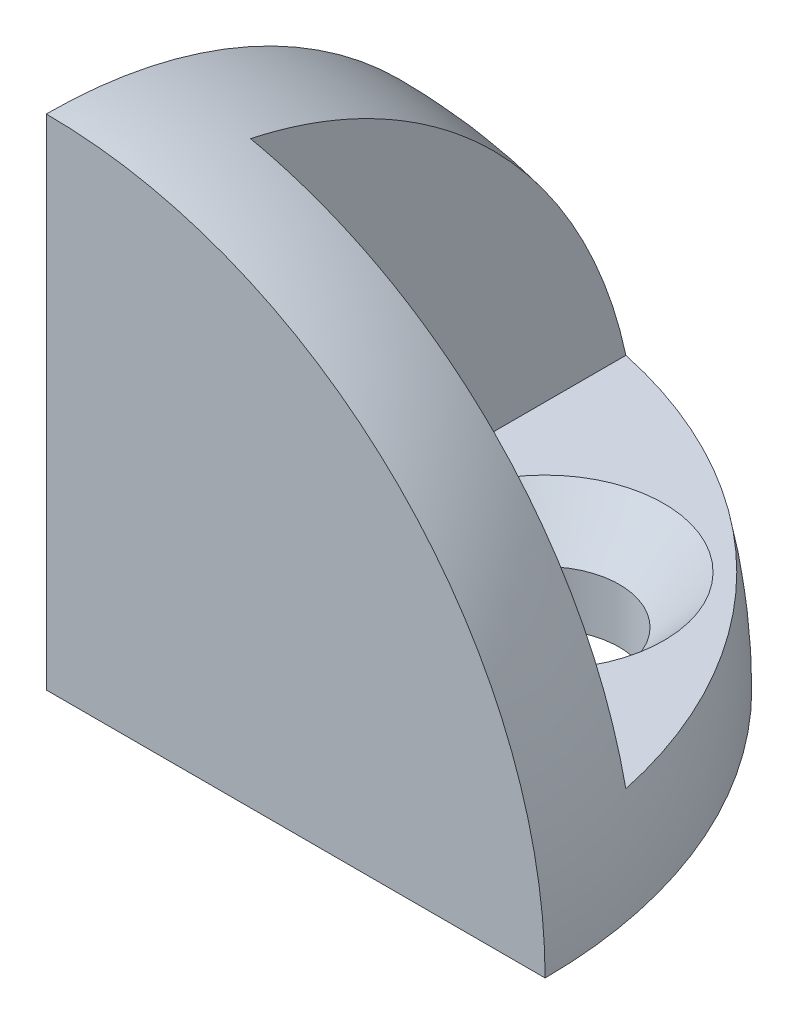
ISO-10303-21;
HEADER;
FILE_DESCRIPTION(('STEP AP214'),'2;1');
FILE_NAME('part.step','',(''),(''),'','','');
FILE_SCHEMA(('AUTOMOTIVE_DESIGN { 1 0 10303 214 1 1 1 1 }'));
ENDSEC;
DATA;
#1=APPLICATION_CONTEXT('core data for automotive mechanical design processes');
#2=APPLICATION_PROTOCOL_DEFINITION('international standard','automotive_design',2000,#1);
#3=PRODUCT_CONTEXT('',#1,'mechanical');
#4=PRODUCT('Part','Part','',(#3));
#5=PRODUCT_RELATED_PRODUCT_CATEGORY('part','',(#4));
#6=PRODUCT_DEFINITION_FORMATION('','',#4);
#7=PRODUCT_DEFINITION_CONTEXT('part definition',#1,'design');
#8=PRODUCT_DEFINITION('design','',#6,#7);
#9=PRODUCT_DEFINITION_SHAPE('','',#8);
#10=(LENGTH_UNIT() NAMED_UNIT(*) SI_UNIT(.MILLI.,.METRE.));
#11=(NAMED_UNIT(*) PLANE_ANGLE_UNIT() SI_UNIT($,.RADIAN.));
#12=(NAMED_UNIT(*) SI_UNIT($,.STERADIAN.) SOLID_ANGLE_UNIT());
#13=UNCERTAINTY_MEASURE_WITH_UNIT(LENGTH_MEASURE(1.E-05),#10,'distance_accuracy_value','');
#14=(GEOMETRIC_REPRESENTATION_CONTEXT(3) GLOBAL_UNCERTAINTY_ASSIGNED_CONTEXT((#13)) GLOBAL_UNIT_ASSIGNED_CONTEXT((#10,
#11,#12)) REPRESENTATION_CONTEXT('',''));
#15=CARTESIAN_POINT('',(0.,0.,0.));
#16=DIRECTION('',(0.,0.,1.));
#17=DIRECTION('',(1.,0.,0.));
#18=AXIS2_PLACEMENT_3D('',#15,#16,#17);
#19=CARTESIAN_POINT('',(-1.46642216231412E-13,0.,-42.));
#20=DIRECTION('',(0.,-1.,0.));
#21=DIRECTION('',(0.,0.,-1.));
#22=AXIS2_PLACEMENT_3D('',#19,#20,#21);
#23=PLANE('',#22);
#24=DIRECTION('',(0.,0.,-1.));
#25=VECTOR('',#24,1.);
#26=CARTESIAN_POINT('',(-1.46642216231412E-13,0.,-42.));
#27=LINE('',#26,#25);
#28=CARTESIAN_POINT('',(0.,0.,0.));
#29=VERTEX_POINT('',#28);
#30=CARTESIAN_POINT('',(-1.46642216231412E-13,0.,-42.));
#31=VERTEX_POINT('',#30);
#32=EDGE_CURVE('E43',#29,#31,#27,.T.);
#33=ORIENTED_EDGE('',*,*,#32,.T.);
#34=CARTESIAN_POINT('',(0.,0.,0.));
#35=DIRECTION('',(0.,-1.,0.));
#36=DIRECTION('',(0.,0.,-1.));
#37=AXIS2_PLACEMENT_3D('',#34,#35,#36);
#38=CIRCLE('',#37,42.);
#39=CARTESIAN_POINT('',(42.,0.,0.));
#40=VERTEX_POINT('',#39);
#41=EDGE_CURVE('E11',#31,#40,#38,.T.);
#42=ORIENTED_EDGE('',*,*,#41,.T.);
#43=DIRECTION('',(1.,0.,0.));
#44=VECTOR('',#43,1.);
#45=CARTESIAN_POINT('',(42.,0.,0.));
#46=LINE('',#45,#44);
#47=EDGE_CURVE('E102',#29,#40,#46,.T.);
#48=ORIENTED_EDGE('',*,*,#47,.F.);
#49=EDGE_LOOP('',(#33,#42,#48));
#50=FACE_BOUND('',#49,.T.);
#51=CARTESIAN_POINT('',(21.0000001344669,0.,-21.000000134467));
#52=DIRECTION('',(0.,1.,0.));
#53=DIRECTION('',(0.,0.,1.));
#54=AXIS2_PLACEMENT_3D('',#51,#52,#53);
#55=CIRCLE('',#54,6.25);
#56=CARTESIAN_POINT('',(21.0000001344669,0.,-14.750000134467));
#57=VERTEX_POINT('',#56);
#58=EDGE_CURVE('E95',#57,#57,#55,.T.);
#59=ORIENTED_EDGE('',*,*,#58,.T.);
#60=EDGE_LOOP('',(#59));
#61=FACE_BOUND('',#60,.T.);
#62=ADVANCED_FACE('F36',(#50,#61),#23,.T.);
#63=CARTESIAN_POINT('',(-1.46642216231412E-13,8.6,-42.));
#64=DIRECTION('',(0.,-1.,0.));
#65=DIRECTION('',(0.,0.,-1.));
#66=AXIS2_PLACEMENT_3D('',#63,#64,#65);
#67=PLANE('',#66);
#68=DIRECTION('',(0.,0.,-1.));
#69=VECTOR('',#68,1.);
#70=CARTESIAN_POINT('',(8.6,8.6,0.));
#71=LINE('',#70,#69);
#72=CARTESIAN_POINT('',(8.59999999999997,8.6,-8.6));
#73=VERTEX_POINT('',#72);
#74=CARTESIAN_POINT('',(8.59999999999986,8.6,-40.2004975093593));
#75=VERTEX_POINT('',#74);
#76=EDGE_CURVE('E50',#73,#75,#71,.T.);
#77=ORIENTED_EDGE('',*,*,#76,.F.);
#78=DIRECTION('',(1.,0.,0.));
#79=VECTOR('',#78,1.);
#80=CARTESIAN_POINT('',(0.,8.6,-8.6));
#81=LINE('',#80,#79);
#82=CARTESIAN_POINT('',(40.2004975093593,8.6,-8.6));
#83=VERTEX_POINT('',#82);
#84=EDGE_CURVE('E76',#73,#83,#81,.T.);
#85=ORIENTED_EDGE('',*,*,#84,.T.);
#86=CARTESIAN_POINT('',(0.,8.6,0.));
#87=DIRECTION('',(0.,-1.,0.));
#88=DIRECTION('',(0.,0.,-1.));
#89=AXIS2_PLACEMENT_3D('',#86,#87,#88);
#90=CIRCLE('',#89,41.1100960835657);
#91=EDGE_CURVE('E90',#75,#83,#90,.T.);
#92=ORIENTED_EDGE('',*,*,#91,.F.);
#93=EDGE_LOOP('',(#77,#85,#92));
#94=FACE_BOUND('',#93,.T.);
#95=CARTESIAN_POINT('',(21.0000001344669,8.6,-21.000000134467));
#96=DIRECTION('',(0.,1.,0.));
#97=DIRECTION('',(0.,0.,1.));
#98=AXIS2_PLACEMENT_3D('',#95,#96,#97);
#99=CIRCLE('',#98,10.);
#100=CARTESIAN_POINT('',(21.0000001344669,8.6,-11.000000134467));
#101=VERTEX_POINT('',#100);
#102=EDGE_CURVE('E157',#101,#101,#99,.T.);
#103=ORIENTED_EDGE('',*,*,#102,.F.);
#104=EDGE_LOOP('',(#103));
#105=FACE_BOUND('',#104,.T.);
#106=ADVANCED_FACE('F88',(#94,#105),#67,.F.);
#107=CARTESIAN_POINT('',(0.,0.,0.));
#108=DIRECTION('',(0.,-1.,0.));
#109=DIRECTION('',(0.,0.,-1.));
#110=AXIS2_PLACEMENT_3D('',#107,#108,#109);
#111=SPHERICAL_SURFACE('',#110,42.);
#112=CARTESIAN_POINT('',(0.,0.,0.));
#113=DIRECTION('',(0.,0.,1.));
#114=DIRECTION('',(1.,0.,0.));
#115=AXIS2_PLACEMENT_3D('',#112,#113,#114);
#116=CIRCLE('',#115,42.);
#117=CARTESIAN_POINT('',(0.,42.,0.));
#118=VERTEX_POINT('',#117);
#119=EDGE_CURVE('E92',#40,#118,#116,.T.);
#120=ORIENTED_EDGE('',*,*,#119,.F.);
#121=ORIENTED_EDGE('',*,*,#41,.F.);
#122=CARTESIAN_POINT('',(0.,0.,0.));
#123=DIRECTION('',(1.,0.,0.));
#124=DIRECTION('',(0.,0.,-1.));
#125=AXIS2_PLACEMENT_3D('',#122,#123,#124);
#126=CIRCLE('',#125,42.);
#127=EDGE_CURVE('E105',#31,#118,#126,.T.);
#128=ORIENTED_EDGE('',*,*,#127,.T.);
#129=EDGE_LOOP('',(#120,#121,#128));
#130=FACE_BOUND('',#129,.T.);
#131=ORIENTED_EDGE('',*,*,#91,.T.);
#132=CARTESIAN_POINT('',(0.,0.,-8.6));
#133=DIRECTION('',(0.,0.,1.));
#134=DIRECTION('',(1.,0.,0.));
#135=AXIS2_PLACEMENT_3D('',#132,#133,#134);
#136=CIRCLE('',#135,41.1100960835657);
#137=CARTESIAN_POINT('',(8.59999999999997,40.2004975093593,-8.6));
#138=VERTEX_POINT('',#137);
#139=EDGE_CURVE('E80',#83,#138,#136,.T.);
#140=ORIENTED_EDGE('',*,*,#139,.T.);
#141=CARTESIAN_POINT('',(8.6,0.,0.));
#142=DIRECTION('',(1.,0.,0.));
#143=DIRECTION('',(0.,0.,-1.));
#144=AXIS2_PLACEMENT_3D('',#141,#142,#143);
#145=CIRCLE('',#144,41.1100960835657);
#146=EDGE_CURVE('E83',#75,#138,#145,.T.);
#147=ORIENTED_EDGE('',*,*,#146,.F.);
#148=EDGE_LOOP('',(#131,#140,#147));
#149=FACE_BOUND('',#148,.T.);
#150=ADVANCED_FACE('F115',(#130,#149),#111,.T.);
#151=CARTESIAN_POINT('',(0.,0.,0.));
#152=DIRECTION('',(1.,0.,0.));
#153=DIRECTION('',(0.,0.,-1.));
#154=AXIS2_PLACEMENT_3D('',#151,#152,#153);
#155=PLANE('',#154);
#156=ORIENTED_EDGE('',*,*,#127,.F.);
#157=ORIENTED_EDGE('',*,*,#32,.F.);
#158=DIRECTION('',(0.,-1.,0.));
#159=VECTOR('',#158,1.);
#160=CARTESIAN_POINT('',(0.,0.,0.));
#161=LINE('',#160,#159);
#162=EDGE_CURVE('E107',#118,#29,#161,.T.);
#163=ORIENTED_EDGE('',*,*,#162,.F.);
#164=EDGE_LOOP('',(#156,#157,#163));
#165=FACE_BOUND('',#164,.T.);
#166=ADVANCED_FACE('F114',(#165),#155,.F.);
#167=CARTESIAN_POINT('',(0.,0.,0.));
#168=DIRECTION('',(0.,0.,1.));
#169=DIRECTION('',(1.,0.,0.));
#170=AXIS2_PLACEMENT_3D('',#167,#168,#169);
#171=PLANE('',#170);
#172=ORIENTED_EDGE('',*,*,#119,.T.);
#173=ORIENTED_EDGE('',*,*,#162,.T.);
#174=ORIENTED_EDGE('',*,*,#47,.T.);
#175=EDGE_LOOP('',(#172,#173,#174));
#176=FACE_BOUND('',#175,.T.);
#177=ADVANCED_FACE('F118',(#176),#171,.T.);
#178=CARTESIAN_POINT('',(8.6,0.,0.));
#179=DIRECTION('',(1.,0.,0.));
#180=DIRECTION('',(0.,0.,-1.));
#181=AXIS2_PLACEMENT_3D('',#178,#179,#180);
#182=PLANE('',#181);
#183=ORIENTED_EDGE('',*,*,#146,.T.);
#184=DIRECTION('',(0.,-1.,0.));
#185=VECTOR('',#184,1.);
#186=CARTESIAN_POINT('',(8.59999999999997,0.,-8.6));
#187=LINE('',#186,#185);
#188=EDGE_CURVE('E78',#138,#73,#187,.T.);
#189=ORIENTED_EDGE('',*,*,#188,.T.);
#190=ORIENTED_EDGE('',*,*,#76,.T.);
#191=EDGE_LOOP('',(#183,#189,#190));
#192=FACE_BOUND('',#191,.T.);
#193=ADVANCED_FACE('F85',(#192),#182,.T.);
#194=CARTESIAN_POINT('',(0.,0.,-8.6));
#195=DIRECTION('',(0.,0.,1.));
#196=DIRECTION('',(1.,0.,0.));
#197=AXIS2_PLACEMENT_3D('',#194,#195,#196);
#198=PLANE('',#197);
#199=ORIENTED_EDGE('',*,*,#139,.F.);
#200=ORIENTED_EDGE('',*,*,#84,.F.);
#201=ORIENTED_EDGE('',*,*,#188,.F.);
#202=EDGE_LOOP('',(#199,#200,#201));
#203=FACE_BOUND('',#202,.T.);
#204=ADVANCED_FACE('F77',(#203),#198,.F.);
#205=CARTESIAN_POINT('',(21.0000001344669,8.6,-21.000000134467));
#206=DIRECTION('',(0.,1.,0.));
#207=DIRECTION('',(0.,0.,1.));
#208=AXIS2_PLACEMENT_3D('',#205,#206,#207);
#209=CYLINDRICAL_SURFACE('',#208,6.25);
#210=CARTESIAN_POINT('',(21.0000001344669,4.57287452367974,-21.000000134467));
#211=DIRECTION('',(0.,1.,0.));
#212=DIRECTION('',(0.,0.,1.));
#213=AXIS2_PLACEMENT_3D('',#210,#211,#212);
#214=CIRCLE('',#213,6.25);
#215=CARTESIAN_POINT('',(21.0000001344669,4.57287452367974,-14.750000134467));
#216=VERTEX_POINT('',#215);
#217=EDGE_CURVE('E154',#216,#216,#214,.T.);
#218=ORIENTED_EDGE('',*,*,#217,.T.);
#219=EDGE_LOOP('',(#218));
#220=FACE_BOUND('',#219,.T.);
#221=ORIENTED_EDGE('',*,*,#58,.F.);
#222=EDGE_LOOP('',(#221));
#223=FACE_BOUND('',#222,.T.);
#224=ADVANCED_FACE('F140',(#220,#223),#209,.F.);
#225=CARTESIAN_POINT('',(21.0000001344669,4.57287452367974,-21.000000134467));
#226=DIRECTION('',(0.,1.,0.));
#227=DIRECTION('',(0.,0.,1.));
#228=AXIS2_PLACEMENT_3D('',#225,#226,#227);
#229=CONICAL_SURFACE('',#228,6.25,0.749779826772141);
#230=ORIENTED_EDGE('',*,*,#102,.T.);
#231=EDGE_LOOP('',(#230));
#232=FACE_BOUND('',#231,.T.);
#233=ORIENTED_EDGE('',*,*,#217,.F.);
#234=EDGE_LOOP('',(#233));
#235=FACE_BOUND('',#234,.T.);
#236=ADVANCED_FACE('F145',(#232,#235),#229,.F.);
#237=CLOSED_SHELL('',(#62,#106,#150,#166,#177,#193,#204,#224,#236));
#238=MANIFOLD_SOLID_BREP('B2',#237);
#239=ADVANCED_BREP_SHAPE_REPRESENTATION('',(#18,#238),#14);
#240=SHAPE_DEFINITION_REPRESENTATION(#9,#239);
ENDSEC;
END-ISO-10303-21;
